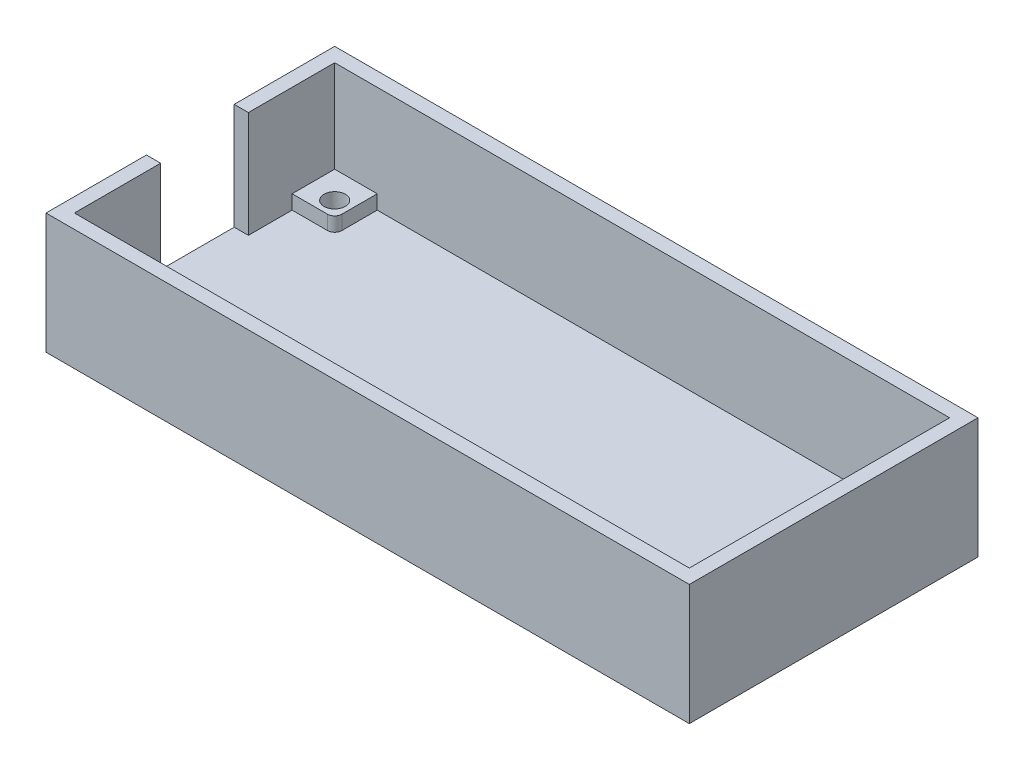
ISO-10303-21;
HEADER;
FILE_DESCRIPTION(('STEP AP214'),'2;1');
FILE_NAME('part.step','',(''),(''),'','','');
FILE_SCHEMA(('AUTOMOTIVE_DESIGN { 1 0 10303 214 1 1 1 1 }'));
ENDSEC;
DATA;
#1=APPLICATION_CONTEXT('core data for automotive mechanical design processes');
#2=APPLICATION_PROTOCOL_DEFINITION('international standard','automotive_design',2000,#1);
#3=PRODUCT_CONTEXT('',#1,'mechanical');
#4=PRODUCT('Part','Part','',(#3));
#5=PRODUCT_RELATED_PRODUCT_CATEGORY('part','',(#4));
#6=PRODUCT_DEFINITION_FORMATION('','',#4);
#7=PRODUCT_DEFINITION_CONTEXT('part definition',#1,'design');
#8=PRODUCT_DEFINITION('design','',#6,#7);
#9=PRODUCT_DEFINITION_SHAPE('','',#8);
#10=(LENGTH_UNIT() NAMED_UNIT(*) SI_UNIT(.MILLI.,.METRE.));
#11=(NAMED_UNIT(*) PLANE_ANGLE_UNIT() SI_UNIT($,.RADIAN.));
#12=(NAMED_UNIT(*) SI_UNIT($,.STERADIAN.) SOLID_ANGLE_UNIT());
#13=UNCERTAINTY_MEASURE_WITH_UNIT(LENGTH_MEASURE(1.E-05),#10,'distance_accuracy_value','');
#14=(GEOMETRIC_REPRESENTATION_CONTEXT(3) GLOBAL_UNCERTAINTY_ASSIGNED_CONTEXT((#13)) GLOBAL_UNIT_ASSIGNED_CONTEXT((#10,
#11,#12)) REPRESENTATION_CONTEXT('',''));
#15=CARTESIAN_POINT('',(0.,0.,0.));
#16=DIRECTION('',(0.,0.,1.));
#17=DIRECTION('',(1.,0.,0.));
#18=AXIS2_PLACEMENT_3D('',#15,#16,#17);
#19=CARTESIAN_POINT('',(0.,2.,0.));
#20=DIRECTION('',(0.,1.,0.));
#21=DIRECTION('',(0.,0.,1.));
#22=AXIS2_PLACEMENT_3D('',#19,#20,#21);
#23=PLANE('',#22);
#24=DIRECTION('',(0.,0.,1.));
#25=VECTOR('',#24,1.);
#26=CARTESIAN_POINT('',(-37.35,2.,13.35));
#27=LINE('',#26,#25);
#28=CARTESIAN_POINT('',(-37.35,2.,13.35));
#29=VERTEX_POINT('',#28);
#30=CARTESIAN_POINT('',(-37.35,2.,18.35));
#31=VERTEX_POINT('',#30);
#32=EDGE_CURVE('E272',#29,#31,#27,.T.);
#33=ORIENTED_EDGE('',*,*,#32,.T.);
#34=DIRECTION('',(1.,0.,0.));
#35=VECTOR('',#34,1.);
#36=CARTESIAN_POINT('',(-43.35,2.,18.35));
#37=LINE('',#36,#35);
#38=CARTESIAN_POINT('',(37.35,2.,18.35));
#39=VERTEX_POINT('',#38);
#40=EDGE_CURVE('E445',#31,#39,#37,.T.);
#41=ORIENTED_EDGE('',*,*,#40,.T.);
#42=DIRECTION('',(0.,0.,1.));
#43=VECTOR('',#42,1.);
#44=CARTESIAN_POINT('',(37.35,2.,13.35));
#45=LINE('',#44,#43);
#46=CARTESIAN_POINT('',(37.35,2.,13.35));
#47=VERTEX_POINT('',#46);
#48=EDGE_CURVE('E296',#47,#39,#45,.T.);
#49=ORIENTED_EDGE('',*,*,#48,.F.);
#50=CARTESIAN_POINT('',(38.35,2.,13.35));
#51=DIRECTION('',(0.,1.,0.));
#52=DIRECTION('',(0.,0.,-1.));
#53=AXIS2_PLACEMENT_3D('',#50,#51,#52);
#54=CIRCLE('',#53,1.);
#55=CARTESIAN_POINT('',(38.35,2.,12.35));
#56=VERTEX_POINT('',#55);
#57=EDGE_CURVE('E311',#56,#47,#54,.T.);
#58=ORIENTED_EDGE('',*,*,#57,.F.);
#59=DIRECTION('',(-1.,0.,0.));
#60=VECTOR('',#59,1.);
#61=CARTESIAN_POINT('',(43.35,2.,12.35));
#62=LINE('',#61,#60);
#63=CARTESIAN_POINT('',(43.35,2.,12.35));
#64=VERTEX_POINT('',#63);
#65=EDGE_CURVE('E291',#64,#56,#62,.T.);
#66=ORIENTED_EDGE('',*,*,#65,.F.);
#67=DIRECTION('',(0.,0.,-1.));
#68=VECTOR('',#67,1.);
#69=CARTESIAN_POINT('',(43.35,2.,18.35));
#70=LINE('',#69,#68);
#71=CARTESIAN_POINT('',(43.35,2.,-12.35));
#72=VERTEX_POINT('',#71);
#73=EDGE_CURVE('E471',#64,#72,#70,.T.);
#74=ORIENTED_EDGE('',*,*,#73,.T.);
#75=DIRECTION('',(-1.,0.,0.));
#76=VECTOR('',#75,1.);
#77=CARTESIAN_POINT('',(43.35,2.,-12.35));
#78=LINE('',#77,#76);
#79=CARTESIAN_POINT('',(38.35,2.,-12.35));
#80=VERTEX_POINT('',#79);
#81=EDGE_CURVE('E340',#72,#80,#78,.T.);
#82=ORIENTED_EDGE('',*,*,#81,.T.);
#83=CARTESIAN_POINT('',(38.35,2.,-13.35));
#84=DIRECTION('',(0.,-1.,0.));
#85=DIRECTION('',(0.,0.,1.));
#86=AXIS2_PLACEMENT_3D('',#83,#84,#85);
#87=CIRCLE('',#86,1.);
#88=CARTESIAN_POINT('',(37.35,2.,-13.35));
#89=VERTEX_POINT('',#88);
#90=EDGE_CURVE('E358',#80,#89,#87,.T.);
#91=ORIENTED_EDGE('',*,*,#90,.T.);
#92=DIRECTION('',(0.,0.,-1.));
#93=VECTOR('',#92,1.);
#94=CARTESIAN_POINT('',(37.35,2.,-13.35));
#95=LINE('',#94,#93);
#96=CARTESIAN_POINT('',(37.35,2.,-18.35));
#97=VERTEX_POINT('',#96);
#98=EDGE_CURVE('E335',#89,#97,#95,.T.);
#99=ORIENTED_EDGE('',*,*,#98,.T.);
#100=DIRECTION('',(-1.,0.,0.));
#101=VECTOR('',#100,1.);
#102=CARTESIAN_POINT('',(43.35,2.,-18.35));
#103=LINE('',#102,#101);
#104=CARTESIAN_POINT('',(-37.35,2.,-18.35));
#105=VERTEX_POINT('',#104);
#106=EDGE_CURVE('E474',#97,#105,#103,.T.);
#107=ORIENTED_EDGE('',*,*,#106,.T.);
#108=DIRECTION('',(0.,0.,-1.));
#109=VECTOR('',#108,1.);
#110=CARTESIAN_POINT('',(-37.35,2.,-13.35));
#111=LINE('',#110,#109);
#112=CARTESIAN_POINT('',(-37.35,2.,-13.35));
#113=VERTEX_POINT('',#112);
#114=EDGE_CURVE('E388',#113,#105,#111,.T.);
#115=ORIENTED_EDGE('',*,*,#114,.F.);
#116=CARTESIAN_POINT('',(-38.35,2.,-13.35));
#117=DIRECTION('',(0.,1.,0.));
#118=DIRECTION('',(0.,0.,1.));
#119=AXIS2_PLACEMENT_3D('',#116,#117,#118);
#120=CIRCLE('',#119,1.);
#121=CARTESIAN_POINT('',(-38.35,2.,-12.35));
#122=VERTEX_POINT('',#121);
#123=EDGE_CURVE('E403',#122,#113,#120,.T.);
#124=ORIENTED_EDGE('',*,*,#123,.F.);
#125=DIRECTION('',(1.,0.,0.));
#126=VECTOR('',#125,1.);
#127=CARTESIAN_POINT('',(-43.35,2.,-12.35));
#128=LINE('',#127,#126);
#129=CARTESIAN_POINT('',(-43.35,2.,-12.35));
#130=VERTEX_POINT('',#129);
#131=EDGE_CURVE('E382',#130,#122,#128,.T.);
#132=ORIENTED_EDGE('',*,*,#131,.F.);
#133=DIRECTION('',(0.,0.,1.));
#134=VECTOR('',#133,1.);
#135=CARTESIAN_POINT('',(-43.35,2.,-18.35));
#136=LINE('',#135,#134);
#137=CARTESIAN_POINT('',(-43.35,2.,-6.18465843842648));
#138=VERTEX_POINT('',#137);
#139=EDGE_CURVE('E459',#130,#138,#136,.T.);
#140=ORIENTED_EDGE('',*,*,#139,.T.);
#141=DIRECTION('',(-1.,0.,0.));
#142=VECTOR('',#141,1.);
#143=CARTESIAN_POINT('',(45.351,2.,-6.18465843842651));
#144=LINE('',#143,#142);
#145=CARTESIAN_POINT('',(-45.35,2.,-6.18465843842648));
#146=VERTEX_POINT('',#145);
#147=EDGE_CURVE('E446',#138,#146,#144,.T.);
#148=ORIENTED_EDGE('',*,*,#147,.T.);
#149=DIRECTION('',(0.,0.,1.));
#150=VECTOR('',#149,1.);
#151=CARTESIAN_POINT('',(-45.35,2.,6.18465843842651));
#152=LINE('',#151,#150);
#153=CARTESIAN_POINT('',(-45.35,2.,6.18465843842651));
#154=VERTEX_POINT('',#153);
#155=EDGE_CURVE('E437',#146,#154,#152,.T.);
#156=ORIENTED_EDGE('',*,*,#155,.T.);
#157=DIRECTION('',(-1.,0.,0.));
#158=VECTOR('',#157,1.);
#159=CARTESIAN_POINT('',(45.351,2.,6.18465843842647));
#160=LINE('',#159,#158);
#161=CARTESIAN_POINT('',(-43.35,2.,6.18465843842651));
#162=VERTEX_POINT('',#161);
#163=EDGE_CURVE('E442',#162,#154,#160,.T.);
#164=ORIENTED_EDGE('',*,*,#163,.F.);
#165=CARTESIAN_POINT('',(-43.35,2.,12.35));
#166=VERTEX_POINT('',#165);
#167=EDGE_CURVE('E477',#162,#166,#136,.T.);
#168=ORIENTED_EDGE('',*,*,#167,.T.);
#169=DIRECTION('',(1.,0.,0.));
#170=VECTOR('',#169,1.);
#171=CARTESIAN_POINT('',(-43.35,2.,12.35));
#172=LINE('',#171,#170);
#173=CARTESIAN_POINT('',(-38.35,2.,12.35));
#174=VERTEX_POINT('',#173);
#175=EDGE_CURVE('E60',#166,#174,#172,.T.);
#176=ORIENTED_EDGE('',*,*,#175,.T.);
#177=CARTESIAN_POINT('',(-38.35,2.,13.35));
#178=DIRECTION('',(0.,-1.,0.));
#179=DIRECTION('',(0.,0.,-1.));
#180=AXIS2_PLACEMENT_3D('',#177,#178,#179);
#181=CIRCLE('',#180,1.);
#182=EDGE_CURVE('E55',#174,#29,#181,.T.);
#183=ORIENTED_EDGE('',*,*,#182,.T.);
#184=EDGE_LOOP('',(#33,#41,#49,#58,#66,#74,#82,#91,#99,#107,#115,#124,#132,#140,#148,#156,#164,
#168,#176,#183));
#185=FACE_BOUND('',#184,.T.);
#186=ADVANCED_FACE('F39',(#185),#23,.T.);
#187=CARTESIAN_POINT('',(-43.35,17.,-18.35));
#188=DIRECTION('',(1.,0.,0.));
#189=DIRECTION('',(0.,0.,-1.));
#190=AXIS2_PLACEMENT_3D('',#187,#188,#189);
#191=PLANE('',#190);
#192=DIRECTION('',(0.,0.,1.));
#193=VECTOR('',#192,1.);
#194=CARTESIAN_POINT('',(-43.35,4.,-18.35));
#195=LINE('',#194,#193);
#196=CARTESIAN_POINT('',(-43.35,4.,-18.35));
#197=VERTEX_POINT('',#196);
#198=CARTESIAN_POINT('',(-43.35,4.,-12.35));
#199=VERTEX_POINT('',#198);
#200=EDGE_CURVE('E383',#197,#199,#195,.T.);
#201=ORIENTED_EDGE('',*,*,#200,.F.);
#202=DIRECTION('',(0.,-1.,0.));
#203=VECTOR('',#202,1.);
#204=CARTESIAN_POINT('',(-43.35,17.,-18.35));
#205=LINE('',#204,#203);
#206=CARTESIAN_POINT('',(-43.35,17.,-18.35));
#207=VERTEX_POINT('',#206);
#208=EDGE_CURVE('E236',#207,#197,#205,.T.);
#209=ORIENTED_EDGE('',*,*,#208,.F.);
#210=DIRECTION('',(0.,0.,1.));
#211=VECTOR('',#210,1.);
#212=CARTESIAN_POINT('',(-43.35,17.,-18.35));
#213=LINE('',#212,#211);
#214=CARTESIAN_POINT('',(-43.35,17.,-6.18465843842648));
#215=VERTEX_POINT('',#214);
#216=EDGE_CURVE('E237',#207,#215,#213,.T.);
#217=ORIENTED_EDGE('',*,*,#216,.T.);
#218=DIRECTION('',(0.,-1.,0.));
#219=VECTOR('',#218,1.);
#220=CARTESIAN_POINT('',(-43.35,2.,-6.18465843842648));
#221=LINE('',#220,#219);
#222=EDGE_CURVE('E423',#215,#138,#221,.T.);
#223=ORIENTED_EDGE('',*,*,#222,.T.);
#224=ORIENTED_EDGE('',*,*,#139,.F.);
#225=DIRECTION('',(0.,-1.,0.));
#226=VECTOR('',#225,1.);
#227=CARTESIAN_POINT('',(-43.35,4.,-12.35));
#228=LINE('',#227,#226);
#229=EDGE_CURVE('E420',#199,#130,#228,.T.);
#230=ORIENTED_EDGE('',*,*,#229,.F.);
#231=EDGE_LOOP('',(#201,#209,#217,#223,#224,#230));
#232=FACE_BOUND('',#231,.T.);
#233=ADVANCED_FACE('F576',(#232),#191,.T.);
#234=CARTESIAN_POINT('',(0.,0.,0.));
#235=DIRECTION('',(0.,1.,0.));
#236=DIRECTION('',(0.,0.,1.));
#237=AXIS2_PLACEMENT_3D('',#234,#235,#236);
#238=PLANE('',#237);
#239=DIRECTION('',(0.,0.,-1.));
#240=VECTOR('',#239,1.);
#241=CARTESIAN_POINT('',(45.35,0.,-20.35));
#242=LINE('',#241,#240);
#243=CARTESIAN_POINT('',(45.35,0.,20.35));
#244=VERTEX_POINT('',#243);
#245=CARTESIAN_POINT('',(45.35,0.,-20.35));
#246=VERTEX_POINT('',#245);
#247=EDGE_CURVE('E524',#244,#246,#242,.T.);
#248=ORIENTED_EDGE('',*,*,#247,.F.);
#249=DIRECTION('',(1.,0.,0.));
#250=VECTOR('',#249,1.);
#251=CARTESIAN_POINT('',(-45.35,0.,20.35));
#252=LINE('',#251,#250);
#253=CARTESIAN_POINT('',(-45.35,0.,20.35));
#254=VERTEX_POINT('',#253);
#255=EDGE_CURVE('E534',#254,#244,#252,.T.);
#256=ORIENTED_EDGE('',*,*,#255,.F.);
#257=DIRECTION('',(0.,0.,1.));
#258=VECTOR('',#257,1.);
#259=CARTESIAN_POINT('',(-45.35,0.,-20.35));
#260=LINE('',#259,#258);
#261=CARTESIAN_POINT('',(-45.35,0.,-20.35));
#262=VERTEX_POINT('',#261);
#263=EDGE_CURVE('E531',#262,#254,#260,.T.);
#264=ORIENTED_EDGE('',*,*,#263,.F.);
#265=DIRECTION('',(-1.,0.,0.));
#266=VECTOR('',#265,1.);
#267=CARTESIAN_POINT('',(-45.35,0.,-20.35));
#268=LINE('',#267,#266);
#269=EDGE_CURVE('E528',#246,#262,#268,.T.);
#270=ORIENTED_EDGE('',*,*,#269,.F.);
#271=EDGE_LOOP('',(#248,#256,#264,#270));
#272=FACE_BOUND('',#271,.T.);
#273=CARTESIAN_POINT('',(-39.5500000000001,0.,-14.5499999999988));
#274=DIRECTION('',(0.,1.,0.));
#275=DIRECTION('',(0.,0.,1.));
#276=AXIS2_PLACEMENT_3D('',#273,#274,#275);
#277=CIRCLE('',#276,1.50000000000051);
#278=CARTESIAN_POINT('',(-39.5500000000001,0.,-13.0499999999983));
#279=VERTEX_POINT('',#278);
#280=EDGE_CURVE('E520',#279,#279,#277,.T.);
#281=ORIENTED_EDGE('',*,*,#280,.T.);
#282=EDGE_LOOP('',(#281));
#283=FACE_BOUND('',#282,.T.);
#284=CARTESIAN_POINT('',(39.5499999999998,0.,-14.5499999999988));
#285=DIRECTION('',(0.,1.,0.));
#286=DIRECTION('',(0.,0.,1.));
#287=AXIS2_PLACEMENT_3D('',#284,#285,#286);
#288=CIRCLE('',#287,1.50000000000051);
#289=CARTESIAN_POINT('',(39.5499999999998,0.,-13.0499999999983));
#290=VERTEX_POINT('',#289);
#291=EDGE_CURVE('E516',#290,#290,#288,.T.);
#292=ORIENTED_EDGE('',*,*,#291,.T.);
#293=EDGE_LOOP('',(#292));
#294=FACE_BOUND('',#293,.T.);
#295=CARTESIAN_POINT('',(-39.5499999999998,0.,14.5500000000012));
#296=DIRECTION('',(0.,1.,0.));
#297=DIRECTION('',(0.,0.,1.));
#298=AXIS2_PLACEMENT_3D('',#295,#296,#297);
#299=CIRCLE('',#298,1.50000000000051);
#300=CARTESIAN_POINT('',(-39.5499999999998,0.,16.0500000000017));
#301=VERTEX_POINT('',#300);
#302=EDGE_CURVE('E512',#301,#301,#299,.T.);
#303=ORIENTED_EDGE('',*,*,#302,.T.);
#304=EDGE_LOOP('',(#303));
#305=FACE_BOUND('',#304,.T.);
#306=CARTESIAN_POINT('',(39.5500000000002,0.,14.5500000000012));
#307=DIRECTION('',(0.,1.,0.));
#308=DIRECTION('',(0.,0.,1.));
#309=AXIS2_PLACEMENT_3D('',#306,#307,#308);
#310=CIRCLE('',#309,1.50000000000051);
#311=CARTESIAN_POINT('',(39.5500000000002,0.,16.0500000000017));
#312=VERTEX_POINT('',#311);
#313=EDGE_CURVE('E508',#312,#312,#310,.T.);
#314=ORIENTED_EDGE('',*,*,#313,.T.);
#315=EDGE_LOOP('',(#314));
#316=FACE_BOUND('',#315,.T.);
#317=ADVANCED_FACE('F558',(#272,#283,#294,#305,#316),#238,.F.);
#318=CARTESIAN_POINT('',(45.35,2.,-20.35));
#319=DIRECTION('',(-1.,0.,0.));
#320=DIRECTION('',(0.,0.,1.));
#321=AXIS2_PLACEMENT_3D('',#318,#319,#320);
#322=PLANE('',#321);
#323=ORIENTED_EDGE('',*,*,#247,.T.);
#324=DIRECTION('',(0.,-1.,0.));
#325=VECTOR('',#324,1.);
#326=CARTESIAN_POINT('',(45.35,2.,-20.35));
#327=LINE('',#326,#325);
#328=CARTESIAN_POINT('',(45.35,17.,-20.35));
#329=VERTEX_POINT('',#328);
#330=EDGE_CURVE('E11',#329,#246,#327,.T.);
#331=ORIENTED_EDGE('',*,*,#330,.F.);
#332=DIRECTION('',(0.,0.,-1.));
#333=VECTOR('',#332,1.);
#334=CARTESIAN_POINT('',(45.35,17.,20.35));
#335=LINE('',#334,#333);
#336=CARTESIAN_POINT('',(45.35,17.,20.35));
#337=VERTEX_POINT('',#336);
#338=EDGE_CURVE('E500',#337,#329,#335,.T.);
#339=ORIENTED_EDGE('',*,*,#338,.F.);
#340=DIRECTION('',(0.,-1.,0.));
#341=VECTOR('',#340,1.);
#342=CARTESIAN_POINT('',(45.35,2.,20.35));
#343=LINE('',#342,#341);
#344=EDGE_CURVE('E537',#337,#244,#343,.T.);
#345=ORIENTED_EDGE('',*,*,#344,.T.);
#346=EDGE_LOOP('',(#323,#331,#339,#345));
#347=FACE_BOUND('',#346,.T.);
#348=ADVANCED_FACE('F41',(#347),#322,.F.);
#349=CARTESIAN_POINT('',(-45.35,2.,-20.35));
#350=DIRECTION('',(0.,0.,1.));
#351=DIRECTION('',(1.,0.,0.));
#352=AXIS2_PLACEMENT_3D('',#349,#350,#351);
#353=PLANE('',#352);
#354=ORIENTED_EDGE('',*,*,#269,.T.);
#355=DIRECTION('',(0.,-1.,0.));
#356=VECTOR('',#355,1.);
#357=CARTESIAN_POINT('',(-45.35,2.,-20.35));
#358=LINE('',#357,#356);
#359=CARTESIAN_POINT('',(-45.35,17.,-20.35));
#360=VERTEX_POINT('',#359);
#361=EDGE_CURVE('E48',#360,#262,#358,.T.);
#362=ORIENTED_EDGE('',*,*,#361,.F.);
#363=DIRECTION('',(-1.,0.,0.));
#364=VECTOR('',#363,1.);
#365=CARTESIAN_POINT('',(45.35,17.,-20.35));
#366=LINE('',#365,#364);
#367=EDGE_CURVE('E504',#329,#360,#366,.T.);
#368=ORIENTED_EDGE('',*,*,#367,.F.);
#369=ORIENTED_EDGE('',*,*,#330,.T.);
#370=EDGE_LOOP('',(#354,#362,#368,#369));
#371=FACE_BOUND('',#370,.T.);
#372=ADVANCED_FACE('F568',(#371),#353,.F.);
#373=CARTESIAN_POINT('',(-45.35,2.,-20.35));
#374=DIRECTION('',(1.,0.,0.));
#375=DIRECTION('',(0.,0.,-1.));
#376=AXIS2_PLACEMENT_3D('',#373,#374,#375);
#377=PLANE('',#376);
#378=ORIENTED_EDGE('',*,*,#155,.F.);
#379=DIRECTION('',(0.,-1.,0.));
#380=VECTOR('',#379,1.);
#381=CARTESIAN_POINT('',(-45.35,2.,-6.18465843842648));
#382=LINE('',#381,#380);
#383=CARTESIAN_POINT('',(-45.35,17.,-6.18465843842648));
#384=VERTEX_POINT('',#383);
#385=EDGE_CURVE('E433',#384,#146,#382,.T.);
#386=ORIENTED_EDGE('',*,*,#385,.F.);
#387=DIRECTION('',(0.,0.,1.));
#388=VECTOR('',#387,1.);
#389=CARTESIAN_POINT('',(-45.35,17.,-20.35));
#390=LINE('',#389,#388);
#391=EDGE_CURVE('E492',#360,#384,#390,.T.);
#392=ORIENTED_EDGE('',*,*,#391,.F.);
#393=ORIENTED_EDGE('',*,*,#361,.T.);
#394=ORIENTED_EDGE('',*,*,#263,.T.);
#395=DIRECTION('',(0.,-1.,0.));
#396=VECTOR('',#395,1.);
#397=CARTESIAN_POINT('',(-45.35,2.,20.35));
#398=LINE('',#397,#396);
#399=CARTESIAN_POINT('',(-45.35,17.,20.35));
#400=VERTEX_POINT('',#399);
#401=EDGE_CURVE('E541',#400,#254,#398,.T.);
#402=ORIENTED_EDGE('',*,*,#401,.F.);
#403=CARTESIAN_POINT('',(-45.35,17.,6.18465843842651));
#404=VERTEX_POINT('',#403);
#405=EDGE_CURVE('E491',#404,#400,#390,.T.);
#406=ORIENTED_EDGE('',*,*,#405,.F.);
#407=DIRECTION('',(0.,1.,0.));
#408=VECTOR('',#407,1.);
#409=CARTESIAN_POINT('',(-45.35,2.,6.18465843842651));
#410=LINE('',#409,#408);
#411=EDGE_CURVE('E430',#154,#404,#410,.T.);
#412=ORIENTED_EDGE('',*,*,#411,.F.);
#413=EDGE_LOOP('',(#378,#386,#392,#393,#394,#402,#406,#412));
#414=FACE_BOUND('',#413,.T.);
#415=ADVANCED_FACE('F550',(#414),#377,.F.);
#416=CARTESIAN_POINT('',(-45.35,2.,20.35));
#417=DIRECTION('',(0.,0.,-1.));
#418=DIRECTION('',(-1.,0.,0.));
#419=AXIS2_PLACEMENT_3D('',#416,#417,#418);
#420=PLANE('',#419);
#421=ORIENTED_EDGE('',*,*,#255,.T.);
#422=ORIENTED_EDGE('',*,*,#344,.F.);
#423=DIRECTION('',(1.,0.,0.));
#424=VECTOR('',#423,1.);
#425=CARTESIAN_POINT('',(-45.35,17.,20.35));
#426=LINE('',#425,#424);
#427=EDGE_CURVE('E496',#400,#337,#426,.T.);
#428=ORIENTED_EDGE('',*,*,#427,.F.);
#429=ORIENTED_EDGE('',*,*,#401,.T.);
#430=EDGE_LOOP('',(#421,#422,#428,#429));
#431=FACE_BOUND('',#430,.T.);
#432=ADVANCED_FACE('F561',(#431),#420,.F.);
#433=CARTESIAN_POINT('',(-39.5500000000001,2.,-14.5499999999988));
#434=DIRECTION('',(0.,-1.,0.));
#435=DIRECTION('',(0.,0.,-1.));
#436=AXIS2_PLACEMENT_3D('',#433,#434,#435);
#437=CYLINDRICAL_SURFACE('',#436,1.50000000000051);
#438=ORIENTED_EDGE('',*,*,#280,.F.);
#439=EDGE_LOOP('',(#438));
#440=FACE_BOUND('',#439,.T.);
#441=CARTESIAN_POINT('',(-39.55,4.,-14.55));
#442=DIRECTION('',(0.,1.,0.));
#443=DIRECTION('',(0.,0.,1.));
#444=AXIS2_PLACEMENT_3D('',#441,#442,#443);
#445=CIRCLE('',#444,1.5);
#446=CARTESIAN_POINT('',(-39.55,4.,-13.05));
#447=VERTEX_POINT('',#446);
#448=EDGE_CURVE('E378',#447,#447,#445,.T.);
#449=ORIENTED_EDGE('',*,*,#448,.T.);
#450=EDGE_LOOP('',(#449));
#451=FACE_BOUND('',#450,.T.);
#452=ADVANCED_FACE('F585',(#440,#451),#437,.F.);
#453=CARTESIAN_POINT('',(39.5499999999998,2.,-14.5499999999988));
#454=DIRECTION('',(0.,-1.,0.));
#455=DIRECTION('',(0.,0.,-1.));
#456=AXIS2_PLACEMENT_3D('',#453,#454,#455);
#457=CYLINDRICAL_SURFACE('',#456,1.50000000000051);
#458=ORIENTED_EDGE('',*,*,#291,.F.);
#459=EDGE_LOOP('',(#458));
#460=FACE_BOUND('',#459,.T.);
#461=CARTESIAN_POINT('',(39.55,4.,-14.55));
#462=DIRECTION('',(0.,-1.,0.));
#463=DIRECTION('',(0.,0.,1.));
#464=AXIS2_PLACEMENT_3D('',#461,#462,#463);
#465=CIRCLE('',#464,1.5);
#466=CARTESIAN_POINT('',(39.55,4.,-13.05));
#467=VERTEX_POINT('',#466);
#468=EDGE_CURVE('E331',#467,#467,#465,.T.);
#469=ORIENTED_EDGE('',*,*,#468,.F.);
#470=EDGE_LOOP('',(#469));
#471=FACE_BOUND('',#470,.T.);
#472=ADVANCED_FACE('F593',(#460,#471),#457,.F.);
#473=CARTESIAN_POINT('',(-39.5499999999998,2.,14.5500000000012));
#474=DIRECTION('',(0.,-1.,0.));
#475=DIRECTION('',(0.,0.,-1.));
#476=AXIS2_PLACEMENT_3D('',#473,#474,#475);
#477=CYLINDRICAL_SURFACE('',#476,1.50000000000051);
#478=ORIENTED_EDGE('',*,*,#302,.F.);
#479=EDGE_LOOP('',(#478));
#480=FACE_BOUND('',#479,.T.);
#481=CARTESIAN_POINT('',(-39.55,4.,14.55));
#482=DIRECTION('',(0.,-1.,0.));
#483=DIRECTION('',(0.,0.,-1.));
#484=AXIS2_PLACEMENT_3D('',#481,#482,#483);
#485=CIRCLE('',#484,1.5);
#486=CARTESIAN_POINT('',(-39.55,4.,13.05));
#487=VERTEX_POINT('',#486);
#488=EDGE_CURVE('E261',#487,#487,#485,.T.);
#489=ORIENTED_EDGE('',*,*,#488,.F.);
#490=EDGE_LOOP('',(#489));
#491=FACE_BOUND('',#490,.T.);
#492=ADVANCED_FACE('F598',(#480,#491),#477,.F.);
#493=CARTESIAN_POINT('',(39.5500000000002,2.,14.5500000000012));
#494=DIRECTION('',(0.,-1.,0.));
#495=DIRECTION('',(0.,0.,-1.));
#496=AXIS2_PLACEMENT_3D('',#493,#494,#495);
#497=CYLINDRICAL_SURFACE('',#496,1.50000000000051);
#498=ORIENTED_EDGE('',*,*,#313,.F.);
#499=EDGE_LOOP('',(#498));
#500=FACE_BOUND('',#499,.T.);
#501=CARTESIAN_POINT('',(39.55,4.,14.55));
#502=DIRECTION('',(0.,1.,0.));
#503=DIRECTION('',(0.,0.,-1.));
#504=AXIS2_PLACEMENT_3D('',#501,#502,#503);
#505=CIRCLE('',#504,1.5);
#506=CARTESIAN_POINT('',(39.55,4.,13.05));
#507=VERTEX_POINT('',#506);
#508=EDGE_CURVE('E287',#507,#507,#505,.T.);
#509=ORIENTED_EDGE('',*,*,#508,.T.);
#510=EDGE_LOOP('',(#509));
#511=FACE_BOUND('',#510,.T.);
#512=ADVANCED_FACE('F647',(#500,#511),#497,.F.);
#513=CARTESIAN_POINT('',(0.,17.,0.));
#514=DIRECTION('',(0.,1.,0.));
#515=DIRECTION('',(0.,0.,1.));
#516=AXIS2_PLACEMENT_3D('',#513,#514,#515);
#517=PLANE('',#516);
#518=DIRECTION('',(-1.,0.,0.));
#519=VECTOR('',#518,1.);
#520=CARTESIAN_POINT('',(45.351,17.,-6.18465843842651));
#521=LINE('',#520,#519);
#522=EDGE_CURVE('E449',#215,#384,#521,.T.);
#523=ORIENTED_EDGE('',*,*,#522,.F.);
#524=ORIENTED_EDGE('',*,*,#216,.F.);
#525=DIRECTION('',(-1.,0.,0.));
#526=VECTOR('',#525,1.);
#527=CARTESIAN_POINT('',(43.35,17.,-18.35));
#528=LINE('',#527,#526);
#529=CARTESIAN_POINT('',(43.35,17.,-18.35));
#530=VERTEX_POINT('',#529);
#531=EDGE_CURVE('E462',#530,#207,#528,.T.);
#532=ORIENTED_EDGE('',*,*,#531,.F.);
#533=DIRECTION('',(0.,0.,-1.));
#534=VECTOR('',#533,1.);
#535=CARTESIAN_POINT('',(43.35,17.,18.35));
#536=LINE('',#535,#534);
#537=CARTESIAN_POINT('',(43.35,17.,18.35));
#538=VERTEX_POINT('',#537);
#539=EDGE_CURVE('E458',#538,#530,#536,.T.);
#540=ORIENTED_EDGE('',*,*,#539,.F.);
#541=DIRECTION('',(1.,0.,0.));
#542=VECTOR('',#541,1.);
#543=CARTESIAN_POINT('',(-43.35,17.,18.35));
#544=LINE('',#543,#542);
#545=CARTESIAN_POINT('',(-43.35,17.,18.35));
#546=VERTEX_POINT('',#545);
#547=EDGE_CURVE('E455',#546,#538,#544,.T.);
#548=ORIENTED_EDGE('',*,*,#547,.F.);
#549=CARTESIAN_POINT('',(-43.35,17.,6.18465843842651));
#550=VERTEX_POINT('',#549);
#551=EDGE_CURVE('E232',#550,#546,#213,.T.);
#552=ORIENTED_EDGE('',*,*,#551,.F.);
#553=DIRECTION('',(-1.,0.,0.));
#554=VECTOR('',#553,1.);
#555=CARTESIAN_POINT('',(45.351,17.,6.18465843842647));
#556=LINE('',#555,#554);
#557=EDGE_CURVE('E441',#550,#404,#556,.T.);
#558=ORIENTED_EDGE('',*,*,#557,.T.);
#559=ORIENTED_EDGE('',*,*,#405,.T.);
#560=ORIENTED_EDGE('',*,*,#427,.T.);
#561=ORIENTED_EDGE('',*,*,#338,.T.);
#562=ORIENTED_EDGE('',*,*,#367,.T.);
#563=ORIENTED_EDGE('',*,*,#391,.T.);
#564=EDGE_LOOP('',(#523,#524,#532,#540,#548,#552,#558,#559,#560,#561,#562,#563));
#565=FACE_BOUND('',#564,.T.);
#566=ADVANCED_FACE('F567',(#565),#517,.T.);
#567=CARTESIAN_POINT('',(-43.35,17.,18.35));
#568=DIRECTION('',(0.,0.,-1.));
#569=DIRECTION('',(-1.,0.,0.));
#570=AXIS2_PLACEMENT_3D('',#567,#568,#569);
#571=PLANE('',#570);
#572=DIRECTION('',(0.,-1.,0.));
#573=VECTOR('',#572,1.);
#574=CARTESIAN_POINT('',(-37.35,4.,18.35));
#575=LINE('',#574,#573);
#576=CARTESIAN_POINT('',(-37.35,4.,18.35));
#577=VERTEX_POINT('',#576);
#578=EDGE_CURVE('E244',#577,#31,#575,.T.);
#579=ORIENTED_EDGE('',*,*,#578,.F.);
#580=DIRECTION('',(-1.,0.,0.));
#581=VECTOR('',#580,1.);
#582=CARTESIAN_POINT('',(-37.35,4.,18.35));
#583=LINE('',#582,#581);
#584=CARTESIAN_POINT('',(-43.35,4.,18.35));
#585=VERTEX_POINT('',#584);
#586=EDGE_CURVE('E240',#577,#585,#583,.T.);
#587=ORIENTED_EDGE('',*,*,#586,.T.);
#588=DIRECTION('',(0.,-1.,0.));
#589=VECTOR('',#588,1.);
#590=CARTESIAN_POINT('',(-43.35,17.,18.35));
#591=LINE('',#590,#589);
#592=EDGE_CURVE('E224',#546,#585,#591,.T.);
#593=ORIENTED_EDGE('',*,*,#592,.F.);
#594=ORIENTED_EDGE('',*,*,#547,.T.);
#595=DIRECTION('',(0.,-1.,0.));
#596=VECTOR('',#595,1.);
#597=CARTESIAN_POINT('',(43.35,17.,18.35));
#598=LINE('',#597,#596);
#599=CARTESIAN_POINT('',(43.35,4.,18.35));
#600=VERTEX_POINT('',#599);
#601=EDGE_CURVE('E487',#538,#600,#598,.T.);
#602=ORIENTED_EDGE('',*,*,#601,.T.);
#603=DIRECTION('',(1.,0.,0.));
#604=VECTOR('',#603,1.);
#605=CARTESIAN_POINT('',(37.35,4.,18.35));
#606=LINE('',#605,#604);
#607=CARTESIAN_POINT('',(37.35,4.,18.35));
#608=VERTEX_POINT('',#607);
#609=EDGE_CURVE('E305',#608,#600,#606,.T.);
#610=ORIENTED_EDGE('',*,*,#609,.F.);
#611=DIRECTION('',(0.,-1.,0.));
#612=VECTOR('',#611,1.);
#613=CARTESIAN_POINT('',(37.35,4.,18.35));
#614=LINE('',#613,#612);
#615=EDGE_CURVE('E308',#608,#39,#614,.T.);
#616=ORIENTED_EDGE('',*,*,#615,.T.);
#617=ORIENTED_EDGE('',*,*,#40,.F.);
#618=EDGE_LOOP('',(#579,#587,#593,#594,#602,#610,#616,#617));
#619=FACE_BOUND('',#618,.T.);
#620=ADVANCED_FACE('F241',(#619),#571,.T.);
#621=CARTESIAN_POINT('',(43.35,17.,18.35));
#622=DIRECTION('',(-1.,0.,0.));
#623=DIRECTION('',(0.,0.,1.));
#624=AXIS2_PLACEMENT_3D('',#621,#622,#623);
#625=PLANE('',#624);
#626=DIRECTION('',(0.,0.,-1.));
#627=VECTOR('',#626,1.);
#628=CARTESIAN_POINT('',(43.35,4.,18.35));
#629=LINE('',#628,#627);
#630=CARTESIAN_POINT('',(43.35,4.,12.35));
#631=VERTEX_POINT('',#630);
#632=EDGE_CURVE('E292',#600,#631,#629,.T.);
#633=ORIENTED_EDGE('',*,*,#632,.F.);
#634=ORIENTED_EDGE('',*,*,#601,.F.);
#635=ORIENTED_EDGE('',*,*,#539,.T.);
#636=DIRECTION('',(0.,-1.,0.));
#637=VECTOR('',#636,1.);
#638=CARTESIAN_POINT('',(43.35,17.,-18.35));
#639=LINE('',#638,#637);
#640=CARTESIAN_POINT('',(43.35,4.,-18.35));
#641=VERTEX_POINT('',#640);
#642=EDGE_CURVE('E483',#530,#641,#639,.T.);
#643=ORIENTED_EDGE('',*,*,#642,.T.);
#644=DIRECTION('',(0.,0.,1.));
#645=VECTOR('',#644,1.);
#646=CARTESIAN_POINT('',(43.35,4.,-18.35));
#647=LINE('',#646,#645);
#648=CARTESIAN_POINT('',(43.35,4.,-12.35));
#649=VERTEX_POINT('',#648);
#650=EDGE_CURVE('E336',#641,#649,#647,.T.);
#651=ORIENTED_EDGE('',*,*,#650,.T.);
#652=DIRECTION('',(0.,-1.,0.));
#653=VECTOR('',#652,1.);
#654=CARTESIAN_POINT('',(43.35,4.,-12.35));
#655=LINE('',#654,#653);
#656=EDGE_CURVE('E355',#649,#72,#655,.T.);
#657=ORIENTED_EDGE('',*,*,#656,.T.);
#658=ORIENTED_EDGE('',*,*,#73,.F.);
#659=DIRECTION('',(0.,-1.,0.));
#660=VECTOR('',#659,1.);
#661=CARTESIAN_POINT('',(43.35,4.,12.35));
#662=LINE('',#661,#660);
#663=EDGE_CURVE('E328',#631,#64,#662,.T.);
#664=ORIENTED_EDGE('',*,*,#663,.F.);
#665=EDGE_LOOP('',(#633,#634,#635,#643,#651,#657,#658,#664));
#666=FACE_BOUND('',#665,.T.);
#667=ADVANCED_FACE('F638',(#666),#625,.T.);
#668=CARTESIAN_POINT('',(43.35,17.,-18.35));
#669=DIRECTION('',(0.,0.,1.));
#670=DIRECTION('',(1.,0.,0.));
#671=AXIS2_PLACEMENT_3D('',#668,#669,#670);
#672=PLANE('',#671);
#673=DIRECTION('',(0.,-1.,0.));
#674=VECTOR('',#673,1.);
#675=CARTESIAN_POINT('',(37.35,4.,-18.35));
#676=LINE('',#675,#674);
#677=CARTESIAN_POINT('',(37.35,4.,-18.35));
#678=VERTEX_POINT('',#677);
#679=EDGE_CURVE('E374',#678,#97,#676,.T.);
#680=ORIENTED_EDGE('',*,*,#679,.F.);
#681=DIRECTION('',(1.,0.,0.));
#682=VECTOR('',#681,1.);
#683=CARTESIAN_POINT('',(37.35,4.,-18.35));
#684=LINE('',#683,#682);
#685=EDGE_CURVE('E339',#678,#641,#684,.T.);
#686=ORIENTED_EDGE('',*,*,#685,.T.);
#687=ORIENTED_EDGE('',*,*,#642,.F.);
#688=ORIENTED_EDGE('',*,*,#531,.T.);
#689=ORIENTED_EDGE('',*,*,#208,.T.);
#690=DIRECTION('',(-1.,0.,0.));
#691=VECTOR('',#690,1.);
#692=CARTESIAN_POINT('',(-37.35,4.,-18.35));
#693=LINE('',#692,#691);
#694=CARTESIAN_POINT('',(-37.35,4.,-18.35));
#695=VERTEX_POINT('',#694);
#696=EDGE_CURVE('E397',#695,#197,#693,.T.);
#697=ORIENTED_EDGE('',*,*,#696,.F.);
#698=DIRECTION('',(0.,-1.,0.));
#699=VECTOR('',#698,1.);
#700=CARTESIAN_POINT('',(-37.35,4.,-18.35));
#701=LINE('',#700,#699);
#702=EDGE_CURVE('E400',#695,#105,#701,.T.);
#703=ORIENTED_EDGE('',*,*,#702,.T.);
#704=ORIENTED_EDGE('',*,*,#106,.F.);
#705=EDGE_LOOP('',(#680,#686,#687,#688,#689,#697,#703,#704));
#706=FACE_BOUND('',#705,.T.);
#707=ADVANCED_FACE('F635',(#706),#672,.T.);
#708=DIRECTION('',(0.,-1.,0.));
#709=VECTOR('',#708,1.);
#710=CARTESIAN_POINT('',(-43.35,4.,12.35));
#711=LINE('',#710,#709);
#712=CARTESIAN_POINT('',(-43.35,4.,12.35));
#713=VERTEX_POINT('',#712);
#714=EDGE_CURVE('E271',#713,#166,#711,.T.);
#715=ORIENTED_EDGE('',*,*,#714,.T.);
#716=ORIENTED_EDGE('',*,*,#167,.F.);
#717=DIRECTION('',(0.,1.,0.));
#718=VECTOR('',#717,1.);
#719=CARTESIAN_POINT('',(-43.35,2.,6.18465843842651));
#720=LINE('',#719,#718);
#721=EDGE_CURVE('E427',#162,#550,#720,.T.);
#722=ORIENTED_EDGE('',*,*,#721,.T.);
#723=ORIENTED_EDGE('',*,*,#551,.T.);
#724=ORIENTED_EDGE('',*,*,#592,.T.);
#725=DIRECTION('',(0.,0.,-1.));
#726=VECTOR('',#725,1.);
#727=CARTESIAN_POINT('',(-43.35,4.,18.35));
#728=LINE('',#727,#726);
#729=EDGE_CURVE('E228',#585,#713,#728,.T.);
#730=ORIENTED_EDGE('',*,*,#729,.T.);
#731=EDGE_LOOP('',(#715,#716,#722,#723,#724,#730));
#732=FACE_BOUND('',#731,.T.);
#733=ADVANCED_FACE('F226',(#732),#191,.T.);
#734=CARTESIAN_POINT('',(45.351,2.,-6.18465843842651));
#735=DIRECTION('',(0.,0.,-1.));
#736=DIRECTION('',(-1.,0.,0.));
#737=AXIS2_PLACEMENT_3D('',#734,#735,#736);
#738=PLANE('',#737);
#739=ORIENTED_EDGE('',*,*,#522,.T.);
#740=ORIENTED_EDGE('',*,*,#385,.T.);
#741=ORIENTED_EDGE('',*,*,#147,.F.);
#742=ORIENTED_EDGE('',*,*,#222,.F.);
#743=EDGE_LOOP('',(#739,#740,#741,#742));
#744=FACE_BOUND('',#743,.T.);
#745=ADVANCED_FACE('F617',(#744),#738,.F.);
#746=CARTESIAN_POINT('',(45.351,2.,6.18465843842647));
#747=DIRECTION('',(0.,0.,1.));
#748=DIRECTION('',(1.,0.,0.));
#749=AXIS2_PLACEMENT_3D('',#746,#747,#748);
#750=PLANE('',#749);
#751=ORIENTED_EDGE('',*,*,#163,.T.);
#752=ORIENTED_EDGE('',*,*,#411,.T.);
#753=ORIENTED_EDGE('',*,*,#557,.F.);
#754=ORIENTED_EDGE('',*,*,#721,.F.);
#755=EDGE_LOOP('',(#751,#752,#753,#754));
#756=FACE_BOUND('',#755,.T.);
#757=ADVANCED_FACE('F607',(#756),#750,.F.);
#758=CARTESIAN_POINT('',(-38.35,4.,-13.35));
#759=DIRECTION('',(0.,1.,0.));
#760=DIRECTION('',(0.,0.,1.));
#761=AXIS2_PLACEMENT_3D('',#758,#759,#760);
#762=PLANE('',#761);
#763=ORIENTED_EDGE('',*,*,#200,.T.);
#764=DIRECTION('',(1.,0.,0.));
#765=VECTOR('',#764,1.);
#766=CARTESIAN_POINT('',(-43.35,4.,-12.35));
#767=LINE('',#766,#765);
#768=CARTESIAN_POINT('',(-38.35,4.,-12.35));
#769=VERTEX_POINT('',#768);
#770=EDGE_CURVE('E387',#199,#769,#767,.T.);
#771=ORIENTED_EDGE('',*,*,#770,.T.);
#772=CARTESIAN_POINT('',(-38.35,4.,-13.35));
#773=DIRECTION('',(0.,1.,0.));
#774=DIRECTION('',(0.,0.,1.));
#775=AXIS2_PLACEMENT_3D('',#772,#773,#774);
#776=CIRCLE('',#775,1.);
#777=CARTESIAN_POINT('',(-37.35,4.,-13.35));
#778=VERTEX_POINT('',#777);
#779=EDGE_CURVE('E391',#769,#778,#776,.T.);
#780=ORIENTED_EDGE('',*,*,#779,.T.);
#781=DIRECTION('',(0.,0.,-1.));
#782=VECTOR('',#781,1.);
#783=CARTESIAN_POINT('',(-37.35,4.,-13.35));
#784=LINE('',#783,#782);
#785=EDGE_CURVE('E394',#778,#695,#784,.T.);
#786=ORIENTED_EDGE('',*,*,#785,.T.);
#787=ORIENTED_EDGE('',*,*,#696,.T.);
#788=EDGE_LOOP('',(#763,#771,#780,#786,#787));
#789=FACE_BOUND('',#788,.T.);
#790=ORIENTED_EDGE('',*,*,#448,.F.);
#791=EDGE_LOOP('',(#790));
#792=FACE_BOUND('',#791,.T.);
#793=ADVANCED_FACE('F604',(#789,#792),#762,.T.);
#794=CARTESIAN_POINT('',(-43.35,4.,-12.35));
#795=DIRECTION('',(0.,0.,-1.));
#796=DIRECTION('',(-1.,0.,0.));
#797=AXIS2_PLACEMENT_3D('',#794,#795,#796);
#798=PLANE('',#797);
#799=ORIENTED_EDGE('',*,*,#131,.T.);
#800=DIRECTION('',(0.,-1.,0.));
#801=VECTOR('',#800,1.);
#802=CARTESIAN_POINT('',(-38.35,4.,-12.35));
#803=LINE('',#802,#801);
#804=EDGE_CURVE('E416',#769,#122,#803,.T.);
#805=ORIENTED_EDGE('',*,*,#804,.F.);
#806=ORIENTED_EDGE('',*,*,#770,.F.);
#807=ORIENTED_EDGE('',*,*,#229,.T.);
#808=EDGE_LOOP('',(#799,#805,#806,#807));
#809=FACE_BOUND('',#808,.T.);
#810=ADVANCED_FACE('F606',(#809),#798,.F.);
#811=CARTESIAN_POINT('',(-38.35,4.,-13.35));
#812=DIRECTION('',(0.,-1.,0.));
#813=DIRECTION('',(0.,0.,-1.));
#814=AXIS2_PLACEMENT_3D('',#811,#812,#813);
#815=CYLINDRICAL_SURFACE('',#814,1.);
#816=ORIENTED_EDGE('',*,*,#123,.T.);
#817=DIRECTION('',(0.,-1.,0.));
#818=VECTOR('',#817,1.);
#819=CARTESIAN_POINT('',(-37.35,4.,-13.35));
#820=LINE('',#819,#818);
#821=EDGE_CURVE('E412',#778,#113,#820,.T.);
#822=ORIENTED_EDGE('',*,*,#821,.F.);
#823=ORIENTED_EDGE('',*,*,#779,.F.);
#824=ORIENTED_EDGE('',*,*,#804,.T.);
#825=EDGE_LOOP('',(#816,#822,#823,#824));
#826=FACE_BOUND('',#825,.T.);
#827=ADVANCED_FACE('F614',(#826),#815,.T.);
#828=CARTESIAN_POINT('',(-37.35,4.,-13.35));
#829=DIRECTION('',(-1.,0.,0.));
#830=DIRECTION('',(0.,0.,1.));
#831=AXIS2_PLACEMENT_3D('',#828,#829,#830);
#832=PLANE('',#831);
#833=ORIENTED_EDGE('',*,*,#114,.T.);
#834=ORIENTED_EDGE('',*,*,#702,.F.);
#835=ORIENTED_EDGE('',*,*,#785,.F.);
#836=ORIENTED_EDGE('',*,*,#821,.T.);
#837=EDGE_LOOP('',(#833,#834,#835,#836));
#838=FACE_BOUND('',#837,.T.);
#839=ADVANCED_FACE('F624',(#838),#832,.F.);
#840=CARTESIAN_POINT('',(37.35,4.,-13.35));
#841=DIRECTION('',(-1.,0.,0.));
#842=DIRECTION('',(0.,0.,1.));
#843=AXIS2_PLACEMENT_3D('',#840,#841,#842);
#844=PLANE('',#843);
#845=ORIENTED_EDGE('',*,*,#98,.F.);
#846=DIRECTION('',(0.,-1.,0.));
#847=VECTOR('',#846,1.);
#848=CARTESIAN_POINT('',(37.35,4.,-13.35));
#849=LINE('',#848,#847);
#850=CARTESIAN_POINT('',(37.35,4.,-13.35));
#851=VERTEX_POINT('',#850);
#852=EDGE_CURVE('E370',#851,#89,#849,.T.);
#853=ORIENTED_EDGE('',*,*,#852,.F.);
#854=DIRECTION('',(0.,0.,-1.));
#855=VECTOR('',#854,1.);
#856=CARTESIAN_POINT('',(37.35,4.,-13.35));
#857=LINE('',#856,#855);
#858=EDGE_CURVE('E343',#851,#678,#857,.T.);
#859=ORIENTED_EDGE('',*,*,#858,.T.);
#860=ORIENTED_EDGE('',*,*,#679,.T.);
#861=EDGE_LOOP('',(#845,#853,#859,#860));
#862=FACE_BOUND('',#861,.T.);
#863=ADVANCED_FACE('F622',(#862),#844,.T.);
#864=CARTESIAN_POINT('',(38.35,4.,-13.35));
#865=DIRECTION('',(0.,-1.,0.));
#866=DIRECTION('',(0.,0.,-1.));
#867=AXIS2_PLACEMENT_3D('',#864,#865,#866);
#868=CYLINDRICAL_SURFACE('',#867,1.);
#869=ORIENTED_EDGE('',*,*,#90,.F.);
#870=DIRECTION('',(0.,-1.,0.));
#871=VECTOR('',#870,1.);
#872=CARTESIAN_POINT('',(38.35,4.,-12.35));
#873=LINE('',#872,#871);
#874=CARTESIAN_POINT('',(38.35,4.,-12.35));
#875=VERTEX_POINT('',#874);
#876=EDGE_CURVE('E366',#875,#80,#873,.T.);
#877=ORIENTED_EDGE('',*,*,#876,.F.);
#878=CARTESIAN_POINT('',(38.35,4.,-13.35));
#879=DIRECTION('',(0.,-1.,0.));
#880=DIRECTION('',(0.,0.,1.));
#881=AXIS2_PLACEMENT_3D('',#878,#879,#880);
#882=CIRCLE('',#881,1.);
#883=EDGE_CURVE('E347',#875,#851,#882,.T.);
#884=ORIENTED_EDGE('',*,*,#883,.T.);
#885=ORIENTED_EDGE('',*,*,#852,.T.);
#886=EDGE_LOOP('',(#869,#877,#884,#885));
#887=FACE_BOUND('',#886,.T.);
#888=ADVANCED_FACE('F700',(#887),#868,.T.);
#889=CARTESIAN_POINT('',(43.35,4.,-12.35));
#890=DIRECTION('',(0.,0.,1.));
#891=DIRECTION('',(1.,0.,0.));
#892=AXIS2_PLACEMENT_3D('',#889,#890,#891);
#893=PLANE('',#892);
#894=ORIENTED_EDGE('',*,*,#81,.F.);
#895=ORIENTED_EDGE('',*,*,#656,.F.);
#896=DIRECTION('',(-1.,0.,0.));
#897=VECTOR('',#896,1.);
#898=CARTESIAN_POINT('',(43.35,4.,-12.35));
#899=LINE('',#898,#897);
#900=EDGE_CURVE('E351',#649,#875,#899,.T.);
#901=ORIENTED_EDGE('',*,*,#900,.T.);
#902=ORIENTED_EDGE('',*,*,#876,.T.);
#903=EDGE_LOOP('',(#894,#895,#901,#902));
#904=FACE_BOUND('',#903,.T.);
#905=ADVANCED_FACE('F697',(#904),#893,.T.);
#906=CARTESIAN_POINT('',(38.35,4.,-13.35));
#907=DIRECTION('',(0.,1.,0.));
#908=DIRECTION('',(0.,0.,1.));
#909=AXIS2_PLACEMENT_3D('',#906,#907,#908);
#910=PLANE('',#909);
#911=ORIENTED_EDGE('',*,*,#468,.T.);
#912=EDGE_LOOP('',(#911));
#913=FACE_BOUND('',#912,.T.);
#914=ORIENTED_EDGE('',*,*,#650,.F.);
#915=ORIENTED_EDGE('',*,*,#685,.F.);
#916=ORIENTED_EDGE('',*,*,#858,.F.);
#917=ORIENTED_EDGE('',*,*,#883,.F.);
#918=ORIENTED_EDGE('',*,*,#900,.F.);
#919=EDGE_LOOP('',(#914,#915,#916,#917,#918));
#920=FACE_BOUND('',#919,.T.);
#921=ADVANCED_FACE('F683',(#913,#920),#910,.T.);
#922=CARTESIAN_POINT('',(38.35,4.,13.35));
#923=DIRECTION('',(0.,1.,0.));
#924=DIRECTION('',(0.,0.,-1.));
#925=AXIS2_PLACEMENT_3D('',#922,#923,#924);
#926=PLANE('',#925);
#927=ORIENTED_EDGE('',*,*,#632,.T.);
#928=DIRECTION('',(-1.,0.,0.));
#929=VECTOR('',#928,1.);
#930=CARTESIAN_POINT('',(43.35,4.,12.35));
#931=LINE('',#930,#929);
#932=CARTESIAN_POINT('',(38.35,4.,12.35));
#933=VERTEX_POINT('',#932);
#934=EDGE_CURVE('E295',#631,#933,#931,.T.);
#935=ORIENTED_EDGE('',*,*,#934,.T.);
#936=CARTESIAN_POINT('',(38.35,4.,13.35));
#937=DIRECTION('',(0.,1.,0.));
#938=DIRECTION('',(0.,0.,-1.));
#939=AXIS2_PLACEMENT_3D('',#936,#937,#938);
#940=CIRCLE('',#939,1.);
#941=CARTESIAN_POINT('',(37.35,4.,13.35));
#942=VERTEX_POINT('',#941);
#943=EDGE_CURVE('E299',#933,#942,#940,.T.);
#944=ORIENTED_EDGE('',*,*,#943,.T.);
#945=DIRECTION('',(0.,0.,1.));
#946=VECTOR('',#945,1.);
#947=CARTESIAN_POINT('',(37.35,4.,13.35));
#948=LINE('',#947,#946);
#949=EDGE_CURVE('E302',#942,#608,#948,.T.);
#950=ORIENTED_EDGE('',*,*,#949,.T.);
#951=ORIENTED_EDGE('',*,*,#609,.T.);
#952=EDGE_LOOP('',(#927,#935,#944,#950,#951));
#953=FACE_BOUND('',#952,.T.);
#954=ORIENTED_EDGE('',*,*,#508,.F.);
#955=EDGE_LOOP('',(#954));
#956=FACE_BOUND('',#955,.T.);
#957=ADVANCED_FACE('F679',(#953,#956),#926,.T.);
#958=CARTESIAN_POINT('',(43.35,4.,12.35));
#959=DIRECTION('',(0.,0.,1.));
#960=DIRECTION('',(1.,0.,0.));
#961=AXIS2_PLACEMENT_3D('',#958,#959,#960);
#962=PLANE('',#961);
#963=ORIENTED_EDGE('',*,*,#65,.T.);
#964=DIRECTION('',(0.,-1.,0.));
#965=VECTOR('',#964,1.);
#966=CARTESIAN_POINT('',(38.35,4.,12.35));
#967=LINE('',#966,#965);
#968=EDGE_CURVE('E324',#933,#56,#967,.T.);
#969=ORIENTED_EDGE('',*,*,#968,.F.);
#970=ORIENTED_EDGE('',*,*,#934,.F.);
#971=ORIENTED_EDGE('',*,*,#663,.T.);
#972=EDGE_LOOP('',(#963,#969,#970,#971));
#973=FACE_BOUND('',#972,.T.);
#974=ADVANCED_FACE('F682',(#973),#962,.F.);
#975=CARTESIAN_POINT('',(38.35,4.,13.35));
#976=DIRECTION('',(0.,-1.,0.));
#977=DIRECTION('',(0.,0.,-1.));
#978=AXIS2_PLACEMENT_3D('',#975,#976,#977);
#979=CYLINDRICAL_SURFACE('',#978,1.);
#980=ORIENTED_EDGE('',*,*,#57,.T.);
#981=DIRECTION('',(0.,-1.,0.));
#982=VECTOR('',#981,1.);
#983=CARTESIAN_POINT('',(37.35,4.,13.35));
#984=LINE('',#983,#982);
#985=EDGE_CURVE('E320',#942,#47,#984,.T.);
#986=ORIENTED_EDGE('',*,*,#985,.F.);
#987=ORIENTED_EDGE('',*,*,#943,.F.);
#988=ORIENTED_EDGE('',*,*,#968,.T.);
#989=EDGE_LOOP('',(#980,#986,#987,#988));
#990=FACE_BOUND('',#989,.T.);
#991=ADVANCED_FACE('F687',(#990),#979,.T.);
#992=CARTESIAN_POINT('',(37.35,4.,13.35));
#993=DIRECTION('',(1.,0.,0.));
#994=DIRECTION('',(0.,0.,-1.));
#995=AXIS2_PLACEMENT_3D('',#992,#993,#994);
#996=PLANE('',#995);
#997=ORIENTED_EDGE('',*,*,#48,.T.);
#998=ORIENTED_EDGE('',*,*,#615,.F.);
#999=ORIENTED_EDGE('',*,*,#949,.F.);
#1000=ORIENTED_EDGE('',*,*,#985,.T.);
#1001=EDGE_LOOP('',(#997,#998,#999,#1000));
#1002=FACE_BOUND('',#1001,.T.);
#1003=ADVANCED_FACE('F677',(#1002),#996,.F.);
#1004=CARTESIAN_POINT('',(-37.35,4.,13.35));
#1005=DIRECTION('',(1.,0.,0.));
#1006=DIRECTION('',(0.,0.,-1.));
#1007=AXIS2_PLACEMENT_3D('',#1004,#1005,#1006);
#1008=PLANE('',#1007);
#1009=ORIENTED_EDGE('',*,*,#32,.F.);
#1010=DIRECTION('',(0.,-1.,0.));
#1011=VECTOR('',#1010,1.);
#1012=CARTESIAN_POINT('',(-37.35,4.,13.35));
#1013=LINE('',#1012,#1011);
#1014=CARTESIAN_POINT('',(-37.35,4.,13.35));
#1015=VERTEX_POINT('',#1014);
#1016=EDGE_CURVE('E282',#1015,#29,#1013,.T.);
#1017=ORIENTED_EDGE('',*,*,#1016,.F.);
#1018=DIRECTION('',(0.,0.,1.));
#1019=VECTOR('',#1018,1.);
#1020=CARTESIAN_POINT('',(-37.35,4.,13.35));
#1021=LINE('',#1020,#1019);
#1022=EDGE_CURVE('E249',#1015,#577,#1021,.T.);
#1023=ORIENTED_EDGE('',*,*,#1022,.T.);
#1024=ORIENTED_EDGE('',*,*,#578,.T.);
#1025=EDGE_LOOP('',(#1009,#1017,#1023,#1024));
#1026=FACE_BOUND('',#1025,.T.);
#1027=ADVANCED_FACE('F673',(#1026),#1008,.T.);
#1028=CARTESIAN_POINT('',(-38.35,4.,13.35));
#1029=DIRECTION('',(0.,-1.,0.));
#1030=DIRECTION('',(0.,0.,-1.));
#1031=AXIS2_PLACEMENT_3D('',#1028,#1029,#1030);
#1032=CYLINDRICAL_SURFACE('',#1031,1.);
#1033=ORIENTED_EDGE('',*,*,#182,.F.);
#1034=DIRECTION('',(0.,-1.,0.));
#1035=VECTOR('',#1034,1.);
#1036=CARTESIAN_POINT('',(-38.35,4.,12.35));
#1037=LINE('',#1036,#1035);
#1038=CARTESIAN_POINT('',(-38.35,4.,12.35));
#1039=VERTEX_POINT('',#1038);
#1040=EDGE_CURVE('E279',#1039,#174,#1037,.T.);
#1041=ORIENTED_EDGE('',*,*,#1040,.F.);
#1042=CARTESIAN_POINT('',(-38.35,4.,13.35));
#1043=DIRECTION('',(0.,-1.,0.));
#1044=DIRECTION('',(0.,0.,-1.));
#1045=AXIS2_PLACEMENT_3D('',#1042,#1043,#1044);
#1046=CIRCLE('',#1045,1.);
#1047=EDGE_CURVE('E265',#1039,#1015,#1046,.T.);
#1048=ORIENTED_EDGE('',*,*,#1047,.T.);
#1049=ORIENTED_EDGE('',*,*,#1016,.T.);
#1050=EDGE_LOOP('',(#1033,#1041,#1048,#1049));
#1051=FACE_BOUND('',#1050,.T.);
#1052=ADVANCED_FACE('F667',(#1051),#1032,.T.);
#1053=CARTESIAN_POINT('',(-43.35,4.,12.35));
#1054=DIRECTION('',(0.,0.,-1.));
#1055=DIRECTION('',(-1.,0.,0.));
#1056=AXIS2_PLACEMENT_3D('',#1053,#1054,#1055);
#1057=PLANE('',#1056);
#1058=ORIENTED_EDGE('',*,*,#175,.F.);
#1059=ORIENTED_EDGE('',*,*,#714,.F.);
#1060=DIRECTION('',(1.,0.,0.));
#1061=VECTOR('',#1060,1.);
#1062=CARTESIAN_POINT('',(-43.35,4.,12.35));
#1063=LINE('',#1062,#1061);
#1064=EDGE_CURVE('E255',#713,#1039,#1063,.T.);
#1065=ORIENTED_EDGE('',*,*,#1064,.T.);
#1066=ORIENTED_EDGE('',*,*,#1040,.T.);
#1067=EDGE_LOOP('',(#1058,#1059,#1065,#1066));
#1068=FACE_BOUND('',#1067,.T.);
#1069=ADVANCED_FACE('F662',(#1068),#1057,.T.);
#1070=CARTESIAN_POINT('',(-38.35,4.,13.35));
#1071=DIRECTION('',(0.,1.,0.));
#1072=DIRECTION('',(0.,0.,-1.));
#1073=AXIS2_PLACEMENT_3D('',#1070,#1071,#1072);
#1074=PLANE('',#1073);
#1075=ORIENTED_EDGE('',*,*,#488,.T.);
#1076=EDGE_LOOP('',(#1075));
#1077=FACE_BOUND('',#1076,.T.);
#1078=ORIENTED_EDGE('',*,*,#729,.F.);
#1079=ORIENTED_EDGE('',*,*,#586,.F.);
#1080=ORIENTED_EDGE('',*,*,#1022,.F.);
#1081=ORIENTED_EDGE('',*,*,#1047,.F.);
#1082=ORIENTED_EDGE('',*,*,#1064,.F.);
#1083=EDGE_LOOP('',(#1078,#1079,#1080,#1081,#1082));
#1084=FACE_BOUND('',#1083,.T.);
#1085=ADVANCED_FACE('F252',(#1077,#1084),#1074,.T.);
#1086=CLOSED_SHELL('',(#186,#233,#317,#348,#372,#415,#432,#452,#472,#492,#512,#566,#620,#667,
#707,#733,#745,#757,#793,#810,#827,#839,#863,#888,#905,#921,#957,#974,#991,#1003,#1027,#1052,
#1069,#1085));
#1087=MANIFOLD_SOLID_BREP('B2',#1086);
#1088=ADVANCED_BREP_SHAPE_REPRESENTATION('',(#18,#1087),#14);
#1089=SHAPE_DEFINITION_REPRESENTATION(#9,#1088);
ENDSEC;
END-ISO-10303-21;
